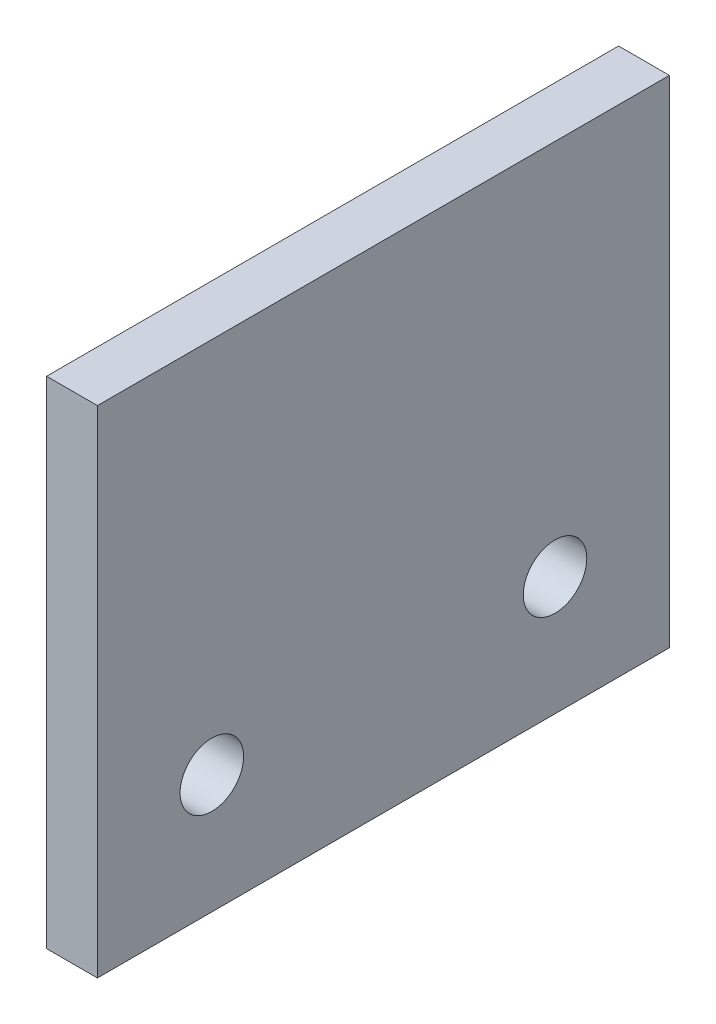
ISO-10303-21;
HEADER;
FILE_DESCRIPTION(('STEP AP214'),'2;1');
FILE_NAME('part.step','',(''),(''),'','','');
FILE_SCHEMA(('AUTOMOTIVE_DESIGN { 1 0 10303 214 1 1 1 1 }'));
ENDSEC;
DATA;
#1=APPLICATION_CONTEXT('core data for automotive mechanical design processes');
#2=APPLICATION_PROTOCOL_DEFINITION('international standard','automotive_design',2000,#1);
#3=PRODUCT_CONTEXT('',#1,'mechanical');
#4=PRODUCT('Part','Part','',(#3));
#5=PRODUCT_RELATED_PRODUCT_CATEGORY('part','',(#4));
#6=PRODUCT_DEFINITION_FORMATION('','',#4);
#7=PRODUCT_DEFINITION_CONTEXT('part definition',#1,'design');
#8=PRODUCT_DEFINITION('design','',#6,#7);
#9=PRODUCT_DEFINITION_SHAPE('','',#8);
#10=(LENGTH_UNIT() NAMED_UNIT(*) SI_UNIT(.MILLI.,.METRE.));
#11=(NAMED_UNIT(*) PLANE_ANGLE_UNIT() SI_UNIT($,.RADIAN.));
#12=(NAMED_UNIT(*) SI_UNIT($,.STERADIAN.) SOLID_ANGLE_UNIT());
#13=UNCERTAINTY_MEASURE_WITH_UNIT(LENGTH_MEASURE(1.E-05),#10,'distance_accuracy_value','');
#14=(GEOMETRIC_REPRESENTATION_CONTEXT(3) GLOBAL_UNCERTAINTY_ASSIGNED_CONTEXT((#13)) GLOBAL_UNIT_ASSIGNED_CONTEXT((#10,
#11,#12)) REPRESENTATION_CONTEXT('',''));
#15=CARTESIAN_POINT('',(0.,0.,0.));
#16=DIRECTION('',(0.,0.,1.));
#17=DIRECTION('',(1.,0.,0.));
#18=AXIS2_PLACEMENT_3D('',#15,#16,#17);
#19=CARTESIAN_POINT('',(16.,0.,0.));
#20=DIRECTION('',(-1.,0.,0.));
#21=DIRECTION('',(0.,-1.,0.));
#22=AXIS2_PLACEMENT_3D('',#19,#20,#21);
#23=PLANE('',#22);
#24=DIRECTION('',(0.,0.,1.));
#25=VECTOR('',#24,1.);
#26=CARTESIAN_POINT('',(16.,29.,-45.));
#27=LINE('',#26,#25);
#28=CARTESIAN_POINT('',(16.,29.,-45.));
#29=VERTEX_POINT('',#28);
#30=CARTESIAN_POINT('',(16.,29.,0.));
#31=VERTEX_POINT('',#30);
#32=EDGE_CURVE('E77',#29,#31,#27,.T.);
#33=ORIENTED_EDGE('',*,*,#32,.F.);
#34=DIRECTION('',(0.,-1.,0.));
#35=VECTOR('',#34,1.);
#36=CARTESIAN_POINT('',(16.,16.0799999999999,-45.));
#37=LINE('',#36,#35);
#38=CARTESIAN_POINT('',(16.,-10.,-45.));
#39=VERTEX_POINT('',#38);
#40=EDGE_CURVE('E53',#29,#39,#37,.T.);
#41=ORIENTED_EDGE('',*,*,#40,.T.);
#42=DIRECTION('',(0.,0.,-1.));
#43=VECTOR('',#42,1.);
#44=CARTESIAN_POINT('',(16.,-10.,0.));
#45=LINE('',#44,#43);
#46=CARTESIAN_POINT('',(16.,-10.,0.));
#47=VERTEX_POINT('',#46);
#48=EDGE_CURVE('E79',#47,#39,#45,.T.);
#49=ORIENTED_EDGE('',*,*,#48,.F.);
#50=DIRECTION('',(0.,-1.,0.));
#51=VECTOR('',#50,1.);
#52=CARTESIAN_POINT('',(16.,16.0799999999999,0.));
#53=LINE('',#52,#51);
#54=EDGE_CURVE('E73',#31,#47,#53,.T.);
#55=ORIENTED_EDGE('',*,*,#54,.F.);
#56=EDGE_LOOP('',(#33,#41,#49,#55));
#57=FACE_BOUND('',#56,.T.);
#58=CARTESIAN_POINT('',(16.,-0.650000000000218,-36.));
#59=DIRECTION('',(1.,0.,0.));
#60=DIRECTION('',(0.,1.,0.));
#61=AXIS2_PLACEMENT_3D('',#58,#59,#60);
#62=CIRCLE('',#61,2.5);
#63=CARTESIAN_POINT('',(16.,1.84999999999978,-36.));
#64=VERTEX_POINT('',#63);
#65=EDGE_CURVE('E82',#64,#64,#62,.F.);
#66=ORIENTED_EDGE('',*,*,#65,.F.);
#67=EDGE_LOOP('',(#66));
#68=FACE_BOUND('',#67,.T.);
#69=CARTESIAN_POINT('',(16.,-0.650000000000218,-9.));
#70=DIRECTION('',(1.,0.,0.));
#71=DIRECTION('',(0.,1.,0.));
#72=AXIS2_PLACEMENT_3D('',#69,#70,#71);
#73=CIRCLE('',#72,2.5);
#74=CARTESIAN_POINT('',(16.,1.84999999999978,-9.));
#75=VERTEX_POINT('',#74);
#76=EDGE_CURVE('E11',#75,#75,#73,.F.);
#77=ORIENTED_EDGE('',*,*,#76,.F.);
#78=EDGE_LOOP('',(#77));
#79=FACE_BOUND('',#78,.T.);
#80=ADVANCED_FACE('F36',(#57,#68,#79),#23,.T.);
#81=CARTESIAN_POINT('',(0.,0.,-45.));
#82=DIRECTION('',(0.,0.,-1.));
#83=DIRECTION('',(-1.,0.,0.));
#84=AXIS2_PLACEMENT_3D('',#81,#82,#83);
#85=PLANE('',#84);
#86=DIRECTION('',(1.,0.,0.));
#87=VECTOR('',#86,1.);
#88=CARTESIAN_POINT('',(20.,-10.,-45.));
#89=LINE('',#88,#87);
#90=CARTESIAN_POINT('',(20.,-10.,-45.));
#91=VERTEX_POINT('',#90);
#92=EDGE_CURVE('E91',#39,#91,#89,.T.);
#93=ORIENTED_EDGE('',*,*,#92,.F.);
#94=ORIENTED_EDGE('',*,*,#40,.F.);
#95=DIRECTION('',(-1.,0.,0.));
#96=VECTOR('',#95,1.);
#97=CARTESIAN_POINT('',(20.,29.,-45.));
#98=LINE('',#97,#96);
#99=CARTESIAN_POINT('',(20.,29.,-45.));
#100=VERTEX_POINT('',#99);
#101=EDGE_CURVE('E94',#100,#29,#98,.T.);
#102=ORIENTED_EDGE('',*,*,#101,.F.);
#103=DIRECTION('',(0.,1.,0.));
#104=VECTOR('',#103,1.);
#105=CARTESIAN_POINT('',(20.,29.,-45.));
#106=LINE('',#105,#104);
#107=EDGE_CURVE('E104',#91,#100,#106,.T.);
#108=ORIENTED_EDGE('',*,*,#107,.F.);
#109=EDGE_LOOP('',(#93,#94,#102,#108));
#110=FACE_BOUND('',#109,.T.);
#111=ADVANCED_FACE('F38',(#110),#85,.T.);
#112=CARTESIAN_POINT('',(20.,29.,-45.));
#113=DIRECTION('',(0.,1.,0.));
#114=DIRECTION('',(-1.,0.,0.));
#115=AXIS2_PLACEMENT_3D('',#112,#113,#114);
#116=PLANE('',#115);
#117=ORIENTED_EDGE('',*,*,#101,.T.);
#118=ORIENTED_EDGE('',*,*,#32,.T.);
#119=DIRECTION('',(-1.,0.,0.));
#120=VECTOR('',#119,1.);
#121=CARTESIAN_POINT('',(20.,29.,0.));
#122=LINE('',#121,#120);
#123=CARTESIAN_POINT('',(20.,29.,0.));
#124=VERTEX_POINT('',#123);
#125=EDGE_CURVE('E86',#124,#31,#122,.T.);
#126=ORIENTED_EDGE('',*,*,#125,.F.);
#127=DIRECTION('',(0.,0.,1.));
#128=VECTOR('',#127,1.);
#129=CARTESIAN_POINT('',(20.,29.,-45.));
#130=LINE('',#129,#128);
#131=EDGE_CURVE('E95',#100,#124,#130,.T.);
#132=ORIENTED_EDGE('',*,*,#131,.F.);
#133=EDGE_LOOP('',(#117,#118,#126,#132));
#134=FACE_BOUND('',#133,.T.);
#135=ADVANCED_FACE('F92',(#134),#116,.T.);
#136=CARTESIAN_POINT('',(20.,29.,-45.));
#137=DIRECTION('',(1.,0.,0.));
#138=DIRECTION('',(0.,1.,0.));
#139=AXIS2_PLACEMENT_3D('',#136,#137,#138);
#140=PLANE('',#139);
#141=CARTESIAN_POINT('',(20.,-0.650000000000218,-36.));
#142=DIRECTION('',(1.,0.,0.));
#143=DIRECTION('',(0.,1.,0.));
#144=AXIS2_PLACEMENT_3D('',#141,#142,#143);
#145=CIRCLE('',#144,2.5);
#146=CARTESIAN_POINT('',(20.,1.84999999999978,-36.));
#147=VERTEX_POINT('',#146);
#148=EDGE_CURVE('E101',#147,#147,#145,.T.);
#149=ORIENTED_EDGE('',*,*,#148,.F.);
#150=EDGE_LOOP('',(#149));
#151=FACE_BOUND('',#150,.T.);
#152=CARTESIAN_POINT('',(20.,-0.650000000000218,-9.));
#153=DIRECTION('',(1.,0.,0.));
#154=DIRECTION('',(0.,1.,0.));
#155=AXIS2_PLACEMENT_3D('',#152,#153,#154);
#156=CIRCLE('',#155,2.5);
#157=CARTESIAN_POINT('',(20.,1.84999999999978,-9.));
#158=VERTEX_POINT('',#157);
#159=EDGE_CURVE('E46',#158,#158,#156,.T.);
#160=ORIENTED_EDGE('',*,*,#159,.F.);
#161=EDGE_LOOP('',(#160));
#162=FACE_BOUND('',#161,.T.);
#163=DIRECTION('',(0.,1.,0.));
#164=VECTOR('',#163,1.);
#165=CARTESIAN_POINT('',(20.,29.,0.));
#166=LINE('',#165,#164);
#167=CARTESIAN_POINT('',(20.,-10.,0.));
#168=VERTEX_POINT('',#167);
#169=EDGE_CURVE('E89',#168,#124,#166,.T.);
#170=ORIENTED_EDGE('',*,*,#169,.F.);
#171=DIRECTION('',(0.,0.,1.));
#172=VECTOR('',#171,1.);
#173=CARTESIAN_POINT('',(20.,-10.,-45.));
#174=LINE('',#173,#172);
#175=EDGE_CURVE('E97',#91,#168,#174,.T.);
#176=ORIENTED_EDGE('',*,*,#175,.F.);
#177=ORIENTED_EDGE('',*,*,#107,.T.);
#178=ORIENTED_EDGE('',*,*,#131,.T.);
#179=EDGE_LOOP('',(#170,#176,#177,#178));
#180=FACE_BOUND('',#179,.T.);
#181=ADVANCED_FACE('F126',(#151,#162,#180),#140,.T.);
#182=CARTESIAN_POINT('',(8.92893218813452,-0.650000000000219,-36.));
#183=DIRECTION('',(1.,0.,0.));
#184=DIRECTION('',(0.,1.,0.));
#185=AXIS2_PLACEMENT_3D('',#182,#183,#184);
#186=CYLINDRICAL_SURFACE('',#185,2.5);
#187=ORIENTED_EDGE('',*,*,#65,.T.);
#188=EDGE_LOOP('',(#187));
#189=FACE_BOUND('',#188,.T.);
#190=ORIENTED_EDGE('',*,*,#148,.T.);
#191=EDGE_LOOP('',(#190));
#192=FACE_BOUND('',#191,.T.);
#193=ADVANCED_FACE('F124',(#189,#192),#186,.F.);
#194=CARTESIAN_POINT('',(8.92893218813452,-0.650000000000219,-9.));
#195=DIRECTION('',(1.,0.,0.));
#196=DIRECTION('',(0.,1.,0.));
#197=AXIS2_PLACEMENT_3D('',#194,#195,#196);
#198=CYLINDRICAL_SURFACE('',#197,2.5);
#199=ORIENTED_EDGE('',*,*,#76,.T.);
#200=EDGE_LOOP('',(#199));
#201=FACE_BOUND('',#200,.T.);
#202=ORIENTED_EDGE('',*,*,#159,.T.);
#203=EDGE_LOOP('',(#202));
#204=FACE_BOUND('',#203,.T.);
#205=ADVANCED_FACE('F134',(#201,#204),#198,.F.);
#206=CARTESIAN_POINT('',(20.,-10.,-45.));
#207=DIRECTION('',(0.,-1.,0.));
#208=DIRECTION('',(1.,0.,0.));
#209=AXIS2_PLACEMENT_3D('',#206,#207,#208);
#210=PLANE('',#209);
#211=ORIENTED_EDGE('',*,*,#48,.T.);
#212=ORIENTED_EDGE('',*,*,#92,.T.);
#213=ORIENTED_EDGE('',*,*,#175,.T.);
#214=DIRECTION('',(1.,0.,0.));
#215=VECTOR('',#214,1.);
#216=CARTESIAN_POINT('',(20.,-10.,0.));
#217=LINE('',#216,#215);
#218=EDGE_CURVE('E40',#47,#168,#217,.T.);
#219=ORIENTED_EDGE('',*,*,#218,.F.);
#220=EDGE_LOOP('',(#211,#212,#213,#219));
#221=FACE_BOUND('',#220,.T.);
#222=ADVANCED_FACE('F131',(#221),#210,.T.);
#223=CARTESIAN_POINT('',(0.,0.,0.));
#224=DIRECTION('',(0.,0.,-1.));
#225=DIRECTION('',(-1.,0.,0.));
#226=AXIS2_PLACEMENT_3D('',#223,#224,#225);
#227=PLANE('',#226);
#228=ORIENTED_EDGE('',*,*,#54,.T.);
#229=ORIENTED_EDGE('',*,*,#218,.T.);
#230=ORIENTED_EDGE('',*,*,#169,.T.);
#231=ORIENTED_EDGE('',*,*,#125,.T.);
#232=EDGE_LOOP('',(#228,#229,#230,#231));
#233=FACE_BOUND('',#232,.T.);
#234=ADVANCED_FACE('F87',(#233),#227,.F.);
#235=CLOSED_SHELL('',(#80,#111,#135,#181,#193,#205,#222,#234));
#236=MANIFOLD_SOLID_BREP('B2',#235);
#237=ADVANCED_BREP_SHAPE_REPRESENTATION('',(#18,#236),#14);
#238=SHAPE_DEFINITION_REPRESENTATION(#9,#237);
ENDSEC;
END-ISO-10303-21;
